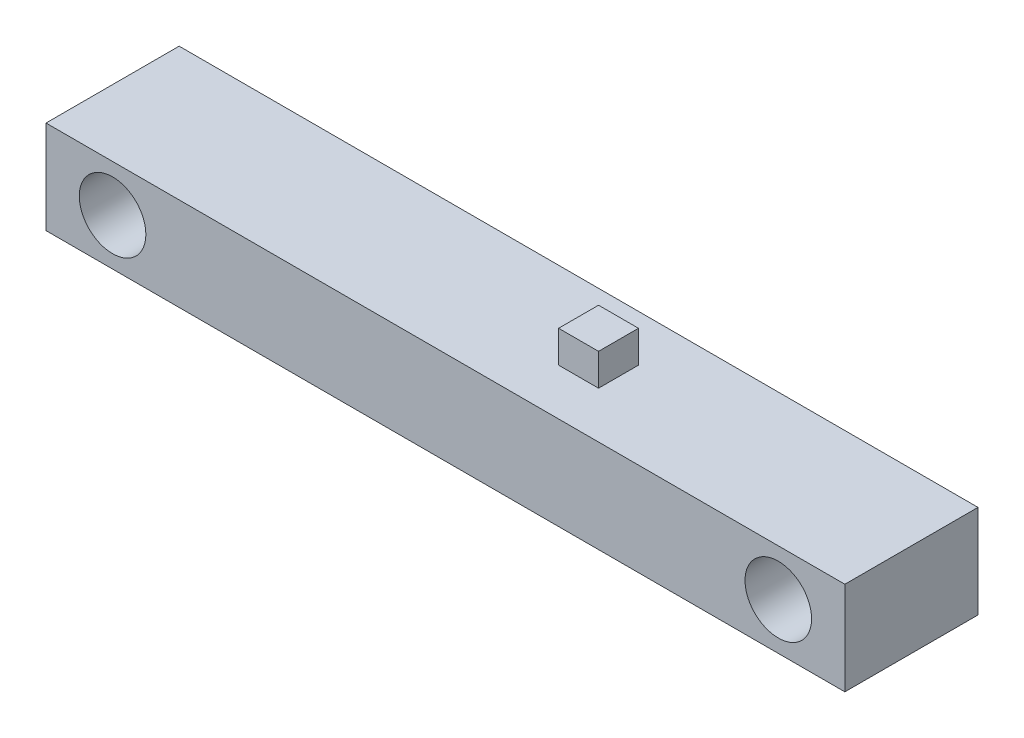
ISO-10303-21;
HEADER;
FILE_DESCRIPTION(('STEP AP214'),'2;1');
FILE_NAME('part.step','',(''),(''),'','','');
FILE_SCHEMA(('AUTOMOTIVE_DESIGN { 1 0 10303 214 1 1 1 1 }'));
ENDSEC;
DATA;
#1=APPLICATION_CONTEXT('core data for automotive mechanical design processes');
#2=APPLICATION_PROTOCOL_DEFINITION('international standard','automotive_design',2000,#1);
#3=PRODUCT_CONTEXT('',#1,'mechanical');
#4=PRODUCT('Part','Part','',(#3));
#5=PRODUCT_RELATED_PRODUCT_CATEGORY('part','',(#4));
#6=PRODUCT_DEFINITION_FORMATION('','',#4);
#7=PRODUCT_DEFINITION_CONTEXT('part definition',#1,'design');
#8=PRODUCT_DEFINITION('design','',#6,#7);
#9=PRODUCT_DEFINITION_SHAPE('','',#8);
#10=(LENGTH_UNIT() NAMED_UNIT(*) SI_UNIT(.MILLI.,.METRE.));
#11=(NAMED_UNIT(*) PLANE_ANGLE_UNIT() SI_UNIT($,.RADIAN.));
#12=(NAMED_UNIT(*) SI_UNIT($,.STERADIAN.) SOLID_ANGLE_UNIT());
#13=UNCERTAINTY_MEASURE_WITH_UNIT(LENGTH_MEASURE(1.E-05),#10,'distance_accuracy_value','');
#14=(GEOMETRIC_REPRESENTATION_CONTEXT(3) GLOBAL_UNCERTAINTY_ASSIGNED_CONTEXT((#13)) GLOBAL_UNIT_ASSIGNED_CONTEXT((#10,
#11,#12)) REPRESENTATION_CONTEXT('',''));
#15=CARTESIAN_POINT('',(0.,0.,0.));
#16=DIRECTION('',(0.,0.,1.));
#17=DIRECTION('',(1.,0.,0.));
#18=AXIS2_PLACEMENT_3D('',#15,#16,#17);
#19=CARTESIAN_POINT('',(0.,35.,0.));
#20=DIRECTION('',(0.,1.,0.));
#21=DIRECTION('',(0.,0.,1.));
#22=AXIS2_PLACEMENT_3D('',#19,#20,#21);
#23=PLANE('',#22);
#24=DIRECTION('',(0.,0.,1.));
#25=VECTOR('',#24,1.);
#26=CARTESIAN_POINT('',(-150.,35.,-50.));
#27=LINE('',#26,#25);
#28=CARTESIAN_POINT('',(-150.,35.,-50.));
#29=VERTEX_POINT('',#28);
#30=CARTESIAN_POINT('',(-150.,35.,0.));
#31=VERTEX_POINT('',#30);
#32=EDGE_CURVE('E158',#29,#31,#27,.T.);
#33=ORIENTED_EDGE('',*,*,#32,.T.);
#34=DIRECTION('',(1.,0.,0.));
#35=VECTOR('',#34,1.);
#36=CARTESIAN_POINT('',(-150.,35.,0.));
#37=LINE('',#36,#35);
#38=CARTESIAN_POINT('',(150.,35.,0.));
#39=VERTEX_POINT('',#38);
#40=EDGE_CURVE('E98',#31,#39,#37,.T.);
#41=ORIENTED_EDGE('',*,*,#40,.T.);
#42=DIRECTION('',(0.,0.,-1.));
#43=VECTOR('',#42,1.);
#44=CARTESIAN_POINT('',(150.,35.,-50.));
#45=LINE('',#44,#43);
#46=CARTESIAN_POINT('',(150.,35.,-50.));
#47=VERTEX_POINT('',#46);
#48=EDGE_CURVE('E163',#39,#47,#45,.T.);
#49=ORIENTED_EDGE('',*,*,#48,.T.);
#50=DIRECTION('',(-1.,0.,0.));
#51=VECTOR('',#50,1.);
#52=CARTESIAN_POINT('',(-150.,35.,-50.));
#53=LINE('',#52,#51);
#54=EDGE_CURVE('E70',#47,#29,#53,.T.);
#55=ORIENTED_EDGE('',*,*,#54,.T.);
#56=EDGE_LOOP('',(#33,#41,#49,#55));
#57=FACE_BOUND('',#56,.T.);
#58=DIRECTION('',(1.,0.,0.));
#59=VECTOR('',#58,1.);
#60=CARTESIAN_POINT('',(25.,35.,-17.5));
#61=LINE('',#60,#59);
#62=CARTESIAN_POINT('',(25.,35.,-17.5));
#63=VERTEX_POINT('',#62);
#64=CARTESIAN_POINT('',(40.,35.,-17.5));
#65=VERTEX_POINT('',#64);
#66=EDGE_CURVE('E246',#63,#65,#61,.T.);
#67=ORIENTED_EDGE('',*,*,#66,.F.);
#68=DIRECTION('',(0.,0.,1.));
#69=VECTOR('',#68,1.);
#70=CARTESIAN_POINT('',(25.,35.,-32.5));
#71=LINE('',#70,#69);
#72=CARTESIAN_POINT('',(25.,35.,-32.5));
#73=VERTEX_POINT('',#72);
#74=EDGE_CURVE('E145',#73,#63,#71,.T.);
#75=ORIENTED_EDGE('',*,*,#74,.F.);
#76=DIRECTION('',(-1.,0.,0.));
#77=VECTOR('',#76,1.);
#78=CARTESIAN_POINT('',(25.,35.,-32.5));
#79=LINE('',#78,#77);
#80=CARTESIAN_POINT('',(40.,35.,-32.5));
#81=VERTEX_POINT('',#80);
#82=EDGE_CURVE('E141',#81,#73,#79,.T.);
#83=ORIENTED_EDGE('',*,*,#82,.F.);
#84=DIRECTION('',(0.,0.,-1.));
#85=VECTOR('',#84,1.);
#86=CARTESIAN_POINT('',(40.,35.,-32.5));
#87=LINE('',#86,#85);
#88=EDGE_CURVE('E265',#65,#81,#87,.T.);
#89=ORIENTED_EDGE('',*,*,#88,.F.);
#90=EDGE_LOOP('',(#67,#75,#83,#89));
#91=FACE_BOUND('',#90,.T.);
#92=ADVANCED_FACE('F45',(#57,#91),#23,.T.);
#93=CARTESIAN_POINT('',(-150.,35.,-50.));
#94=DIRECTION('',(1.,0.,0.));
#95=DIRECTION('',(0.,0.,-1.));
#96=AXIS2_PLACEMENT_3D('',#93,#94,#95);
#97=PLANE('',#96);
#98=DIRECTION('',(0.,0.,1.));
#99=VECTOR('',#98,1.);
#100=CARTESIAN_POINT('',(-150.,0.,-50.));
#101=LINE('',#100,#99);
#102=CARTESIAN_POINT('',(-150.,0.,-50.));
#103=VERTEX_POINT('',#102);
#104=CARTESIAN_POINT('',(-150.,0.,0.));
#105=VERTEX_POINT('',#104);
#106=EDGE_CURVE('E148',#103,#105,#101,.T.);
#107=ORIENTED_EDGE('',*,*,#106,.T.);
#108=DIRECTION('',(0.,-1.,0.));
#109=VECTOR('',#108,1.);
#110=CARTESIAN_POINT('',(-150.,35.,0.));
#111=LINE('',#110,#109);
#112=EDGE_CURVE('E11',#31,#105,#111,.T.);
#113=ORIENTED_EDGE('',*,*,#112,.F.);
#114=ORIENTED_EDGE('',*,*,#32,.F.);
#115=DIRECTION('',(0.,-1.,0.));
#116=VECTOR('',#115,1.);
#117=CARTESIAN_POINT('',(-150.,35.,-50.));
#118=LINE('',#117,#116);
#119=EDGE_CURVE('E167',#29,#103,#118,.T.);
#120=ORIENTED_EDGE('',*,*,#119,.T.);
#121=EDGE_LOOP('',(#107,#113,#114,#120));
#122=FACE_BOUND('',#121,.T.);
#123=ADVANCED_FACE('F47',(#122),#97,.F.);
#124=CARTESIAN_POINT('',(-150.,35.,0.));
#125=DIRECTION('',(0.,0.,-1.));
#126=DIRECTION('',(-1.,0.,0.));
#127=AXIS2_PLACEMENT_3D('',#124,#125,#126);
#128=PLANE('',#127);
#129=CARTESIAN_POINT('',(-125.,17.5,0.));
#130=DIRECTION('',(0.,0.,1.));
#131=DIRECTION('',(1.,0.,0.));
#132=AXIS2_PLACEMENT_3D('',#129,#130,#131);
#133=CIRCLE('',#132,12.5);
#134=CARTESIAN_POINT('',(-112.5,17.5,0.));
#135=VERTEX_POINT('',#134);
#136=EDGE_CURVE('E239',#135,#135,#133,.T.);
#137=ORIENTED_EDGE('',*,*,#136,.F.);
#138=EDGE_LOOP('',(#137));
#139=FACE_BOUND('',#138,.T.);
#140=CARTESIAN_POINT('',(125.,17.5,0.));
#141=DIRECTION('',(0.,0.,1.));
#142=DIRECTION('',(1.,0.,0.));
#143=AXIS2_PLACEMENT_3D('',#140,#141,#142);
#144=CIRCLE('',#143,12.5);
#145=CARTESIAN_POINT('',(137.5,17.5,0.));
#146=VERTEX_POINT('',#145);
#147=EDGE_CURVE('E248',#146,#146,#144,.T.);
#148=ORIENTED_EDGE('',*,*,#147,.F.);
#149=EDGE_LOOP('',(#148));
#150=FACE_BOUND('',#149,.T.);
#151=DIRECTION('',(1.,0.,0.));
#152=VECTOR('',#151,1.);
#153=CARTESIAN_POINT('',(-150.,0.,0.));
#154=LINE('',#153,#152);
#155=CARTESIAN_POINT('',(150.,0.,0.));
#156=VERTEX_POINT('',#155);
#157=EDGE_CURVE('E153',#105,#156,#154,.T.);
#158=ORIENTED_EDGE('',*,*,#157,.T.);
#159=DIRECTION('',(0.,-1.,0.));
#160=VECTOR('',#159,1.);
#161=CARTESIAN_POINT('',(150.,35.,0.));
#162=LINE('',#161,#160);
#163=EDGE_CURVE('E54',#39,#156,#162,.T.);
#164=ORIENTED_EDGE('',*,*,#163,.F.);
#165=ORIENTED_EDGE('',*,*,#40,.F.);
#166=ORIENTED_EDGE('',*,*,#112,.T.);
#167=EDGE_LOOP('',(#158,#164,#165,#166));
#168=FACE_BOUND('',#167,.T.);
#169=ADVANCED_FACE('F204',(#139,#150,#168),#128,.F.);
#170=CARTESIAN_POINT('',(150.,35.,-50.));
#171=DIRECTION('',(-1.,0.,0.));
#172=DIRECTION('',(0.,0.,1.));
#173=AXIS2_PLACEMENT_3D('',#170,#171,#172);
#174=PLANE('',#173);
#175=DIRECTION('',(0.,0.,-1.));
#176=VECTOR('',#175,1.);
#177=CARTESIAN_POINT('',(150.,0.,-50.));
#178=LINE('',#177,#176);
#179=CARTESIAN_POINT('',(150.,0.,-50.));
#180=VERTEX_POINT('',#179);
#181=EDGE_CURVE('E171',#156,#180,#178,.T.);
#182=ORIENTED_EDGE('',*,*,#181,.T.);
#183=DIRECTION('',(0.,-1.,0.));
#184=VECTOR('',#183,1.);
#185=CARTESIAN_POINT('',(150.,35.,-50.));
#186=LINE('',#185,#184);
#187=EDGE_CURVE('E178',#47,#180,#186,.T.);
#188=ORIENTED_EDGE('',*,*,#187,.F.);
#189=ORIENTED_EDGE('',*,*,#48,.F.);
#190=ORIENTED_EDGE('',*,*,#163,.T.);
#191=EDGE_LOOP('',(#182,#188,#189,#190));
#192=FACE_BOUND('',#191,.T.);
#193=ADVANCED_FACE('F185',(#192),#174,.F.);
#194=CARTESIAN_POINT('',(-150.,35.,-50.));
#195=DIRECTION('',(0.,0.,1.));
#196=DIRECTION('',(1.,0.,0.));
#197=AXIS2_PLACEMENT_3D('',#194,#195,#196);
#198=PLANE('',#197);
#199=CARTESIAN_POINT('',(-125.,17.5,-50.));
#200=DIRECTION('',(0.,0.,1.));
#201=DIRECTION('',(1.,0.,0.));
#202=AXIS2_PLACEMENT_3D('',#199,#200,#201);
#203=CIRCLE('',#202,12.5);
#204=CARTESIAN_POINT('',(-112.5,17.5,-50.));
#205=VERTEX_POINT('',#204);
#206=EDGE_CURVE('E241',#205,#205,#203,.F.);
#207=ORIENTED_EDGE('',*,*,#206,.F.);
#208=EDGE_LOOP('',(#207));
#209=FACE_BOUND('',#208,.T.);
#210=CARTESIAN_POINT('',(125.,17.5,-50.));
#211=DIRECTION('',(0.,0.,1.));
#212=DIRECTION('',(1.,0.,0.));
#213=AXIS2_PLACEMENT_3D('',#210,#211,#212);
#214=CIRCLE('',#213,12.5);
#215=CARTESIAN_POINT('',(137.5,17.5,-50.));
#216=VERTEX_POINT('',#215);
#217=EDGE_CURVE('E251',#216,#216,#214,.F.);
#218=ORIENTED_EDGE('',*,*,#217,.F.);
#219=EDGE_LOOP('',(#218));
#220=FACE_BOUND('',#219,.T.);
#221=DIRECTION('',(-1.,0.,0.));
#222=VECTOR('',#221,1.);
#223=CARTESIAN_POINT('',(-150.,0.,-50.));
#224=LINE('',#223,#222);
#225=EDGE_CURVE('E91',#180,#103,#224,.T.);
#226=ORIENTED_EDGE('',*,*,#225,.T.);
#227=ORIENTED_EDGE('',*,*,#119,.F.);
#228=ORIENTED_EDGE('',*,*,#54,.F.);
#229=ORIENTED_EDGE('',*,*,#187,.T.);
#230=EDGE_LOOP('',(#226,#227,#228,#229));
#231=FACE_BOUND('',#230,.T.);
#232=ADVANCED_FACE('F193',(#209,#220,#231),#198,.F.);
#233=CARTESIAN_POINT('',(0.,0.,0.));
#234=DIRECTION('',(0.,1.,0.));
#235=DIRECTION('',(0.,0.,1.));
#236=AXIS2_PLACEMENT_3D('',#233,#234,#235);
#237=PLANE('',#236);
#238=ORIENTED_EDGE('',*,*,#106,.F.);
#239=ORIENTED_EDGE('',*,*,#225,.F.);
#240=ORIENTED_EDGE('',*,*,#181,.F.);
#241=ORIENTED_EDGE('',*,*,#157,.F.);
#242=EDGE_LOOP('',(#238,#239,#240,#241));
#243=FACE_BOUND('',#242,.T.);
#244=ADVANCED_FACE('F189',(#243),#237,.F.);
#245=CARTESIAN_POINT('',(25.,47.,-32.5));
#246=DIRECTION('',(1.,0.,0.));
#247=DIRECTION('',(0.,0.,-1.));
#248=AXIS2_PLACEMENT_3D('',#245,#246,#247);
#249=PLANE('',#248);
#250=ORIENTED_EDGE('',*,*,#74,.T.);
#251=DIRECTION('',(0.,-1.,0.));
#252=VECTOR('',#251,1.);
#253=CARTESIAN_POINT('',(25.,47.,-17.5));
#254=LINE('',#253,#252);
#255=CARTESIAN_POINT('',(25.,47.,-17.5));
#256=VERTEX_POINT('',#255);
#257=EDGE_CURVE('E124',#256,#63,#254,.T.);
#258=ORIENTED_EDGE('',*,*,#257,.F.);
#259=DIRECTION('',(0.,0.,1.));
#260=VECTOR('',#259,1.);
#261=CARTESIAN_POINT('',(25.,47.,-32.5));
#262=LINE('',#261,#260);
#263=CARTESIAN_POINT('',(25.,47.,-32.5));
#264=VERTEX_POINT('',#263);
#265=EDGE_CURVE('E132',#264,#256,#262,.T.);
#266=ORIENTED_EDGE('',*,*,#265,.F.);
#267=DIRECTION('',(0.,-1.,0.));
#268=VECTOR('',#267,1.);
#269=CARTESIAN_POINT('',(25.,47.,-32.5));
#270=LINE('',#269,#268);
#271=EDGE_CURVE('E261',#264,#73,#270,.T.);
#272=ORIENTED_EDGE('',*,*,#271,.T.);
#273=EDGE_LOOP('',(#250,#258,#266,#272));
#274=FACE_BOUND('',#273,.T.);
#275=ADVANCED_FACE('F143',(#274),#249,.F.);
#276=CARTESIAN_POINT('',(25.,47.,-17.5));
#277=DIRECTION('',(0.,0.,-1.));
#278=DIRECTION('',(-1.,0.,0.));
#279=AXIS2_PLACEMENT_3D('',#276,#277,#278);
#280=PLANE('',#279);
#281=ORIENTED_EDGE('',*,*,#66,.T.);
#282=DIRECTION('',(0.,-1.,0.));
#283=VECTOR('',#282,1.);
#284=CARTESIAN_POINT('',(40.,47.,-17.5));
#285=LINE('',#284,#283);
#286=CARTESIAN_POINT('',(40.,47.,-17.5));
#287=VERTEX_POINT('',#286);
#288=EDGE_CURVE('E127',#287,#65,#285,.T.);
#289=ORIENTED_EDGE('',*,*,#288,.F.);
#290=DIRECTION('',(1.,0.,0.));
#291=VECTOR('',#290,1.);
#292=CARTESIAN_POINT('',(25.,47.,-17.5));
#293=LINE('',#292,#291);
#294=EDGE_CURVE('E120',#256,#287,#293,.T.);
#295=ORIENTED_EDGE('',*,*,#294,.F.);
#296=ORIENTED_EDGE('',*,*,#257,.T.);
#297=EDGE_LOOP('',(#281,#289,#295,#296));
#298=FACE_BOUND('',#297,.T.);
#299=ADVANCED_FACE('F122',(#298),#280,.F.);
#300=CARTESIAN_POINT('',(40.,47.,-32.5));
#301=DIRECTION('',(-1.,0.,0.));
#302=DIRECTION('',(0.,0.,1.));
#303=AXIS2_PLACEMENT_3D('',#300,#301,#302);
#304=PLANE('',#303);
#305=ORIENTED_EDGE('',*,*,#88,.T.);
#306=DIRECTION('',(0.,-1.,0.));
#307=VECTOR('',#306,1.);
#308=CARTESIAN_POINT('',(40.,47.,-32.5));
#309=LINE('',#308,#307);
#310=CARTESIAN_POINT('',(40.,47.,-32.5));
#311=VERTEX_POINT('',#310);
#312=EDGE_CURVE('E61',#311,#81,#309,.T.);
#313=ORIENTED_EDGE('',*,*,#312,.F.);
#314=DIRECTION('',(0.,0.,-1.));
#315=VECTOR('',#314,1.);
#316=CARTESIAN_POINT('',(40.,47.,-32.5));
#317=LINE('',#316,#315);
#318=EDGE_CURVE('E131',#287,#311,#317,.T.);
#319=ORIENTED_EDGE('',*,*,#318,.F.);
#320=ORIENTED_EDGE('',*,*,#288,.T.);
#321=EDGE_LOOP('',(#305,#313,#319,#320));
#322=FACE_BOUND('',#321,.T.);
#323=ADVANCED_FACE('F219',(#322),#304,.F.);
#324=CARTESIAN_POINT('',(25.,47.,-32.5));
#325=DIRECTION('',(0.,0.,1.));
#326=DIRECTION('',(1.,0.,0.));
#327=AXIS2_PLACEMENT_3D('',#324,#325,#326);
#328=PLANE('',#327);
#329=ORIENTED_EDGE('',*,*,#82,.T.);
#330=ORIENTED_EDGE('',*,*,#271,.F.);
#331=DIRECTION('',(-1.,0.,0.));
#332=VECTOR('',#331,1.);
#333=CARTESIAN_POINT('',(25.,47.,-32.5));
#334=LINE('',#333,#332);
#335=EDGE_CURVE('E136',#311,#264,#334,.T.);
#336=ORIENTED_EDGE('',*,*,#335,.F.);
#337=ORIENTED_EDGE('',*,*,#312,.T.);
#338=EDGE_LOOP('',(#329,#330,#336,#337));
#339=FACE_BOUND('',#338,.T.);
#340=ADVANCED_FACE('F222',(#339),#328,.F.);
#341=CARTESIAN_POINT('',(0.,47.,0.));
#342=DIRECTION('',(0.,1.,0.));
#343=DIRECTION('',(0.,0.,1.));
#344=AXIS2_PLACEMENT_3D('',#341,#342,#343);
#345=PLANE('',#344);
#346=ORIENTED_EDGE('',*,*,#265,.T.);
#347=ORIENTED_EDGE('',*,*,#294,.T.);
#348=ORIENTED_EDGE('',*,*,#318,.T.);
#349=ORIENTED_EDGE('',*,*,#335,.T.);
#350=EDGE_LOOP('',(#346,#347,#348,#349));
#351=FACE_BOUND('',#350,.T.);
#352=ADVANCED_FACE('F135',(#351),#345,.T.);
#353=CARTESIAN_POINT('',(125.,17.5,-50.001));
#354=DIRECTION('',(0.,0.,1.));
#355=DIRECTION('',(1.,0.,0.));
#356=AXIS2_PLACEMENT_3D('',#353,#354,#355);
#357=CYLINDRICAL_SURFACE('',#356,12.5);
#358=ORIENTED_EDGE('',*,*,#147,.T.);
#359=EDGE_LOOP('',(#358));
#360=FACE_BOUND('',#359,.T.);
#361=ORIENTED_EDGE('',*,*,#217,.T.);
#362=EDGE_LOOP('',(#361));
#363=FACE_BOUND('',#362,.T.);
#364=ADVANCED_FACE('F228',(#360,#363),#357,.F.);
#365=CARTESIAN_POINT('',(-125.,17.5,-50.001));
#366=DIRECTION('',(0.,0.,1.));
#367=DIRECTION('',(1.,0.,0.));
#368=AXIS2_PLACEMENT_3D('',#365,#366,#367);
#369=CYLINDRICAL_SURFACE('',#368,12.5);
#370=ORIENTED_EDGE('',*,*,#136,.T.);
#371=EDGE_LOOP('',(#370));
#372=FACE_BOUND('',#371,.T.);
#373=ORIENTED_EDGE('',*,*,#206,.T.);
#374=EDGE_LOOP('',(#373));
#375=FACE_BOUND('',#374,.T.);
#376=ADVANCED_FACE('F230',(#372,#375),#369,.F.);
#377=CLOSED_SHELL('',(#92,#123,#169,#193,#232,#244,#275,#299,#323,#340,#352,#364,#376));
#378=MANIFOLD_SOLID_BREP('B2',#377);
#379=ADVANCED_BREP_SHAPE_REPRESENTATION('',(#18,#378),#14);
#380=SHAPE_DEFINITION_REPRESENTATION(#9,#379);
ENDSEC;
END-ISO-10303-21;
